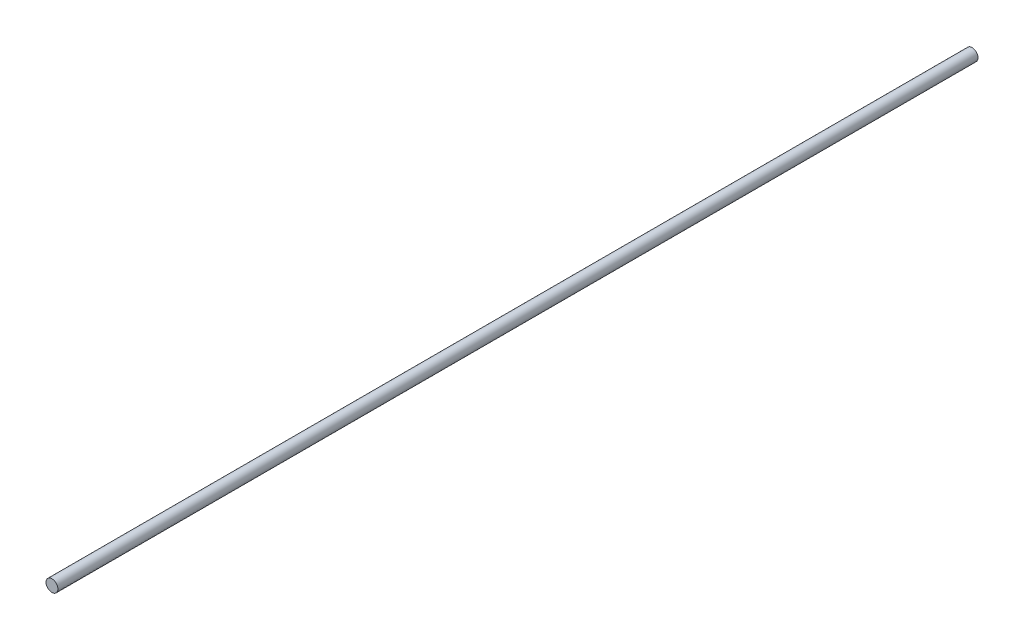
ISO-10303-21;
HEADER;
FILE_DESCRIPTION(('STEP AP214'),'2;1');
FILE_NAME('part.step','',(''),(''),'','','');
FILE_SCHEMA(('AUTOMOTIVE_DESIGN { 1 0 10303 214 1 1 1 1 }'));
ENDSEC;
DATA;
#1=APPLICATION_CONTEXT('core data for automotive mechanical design processes');
#2=APPLICATION_PROTOCOL_DEFINITION('international standard','automotive_design',2000,#1);
#3=PRODUCT_CONTEXT('',#1,'mechanical');
#4=PRODUCT('Part','Part','',(#3));
#5=PRODUCT_RELATED_PRODUCT_CATEGORY('part','',(#4));
#6=PRODUCT_DEFINITION_FORMATION('','',#4);
#7=PRODUCT_DEFINITION_CONTEXT('part definition',#1,'design');
#8=PRODUCT_DEFINITION('design','',#6,#7);
#9=PRODUCT_DEFINITION_SHAPE('','',#8);
#10=(LENGTH_UNIT() NAMED_UNIT(*) SI_UNIT(.MILLI.,.METRE.));
#11=(NAMED_UNIT(*) PLANE_ANGLE_UNIT() SI_UNIT($,.RADIAN.));
#12=(NAMED_UNIT(*) SI_UNIT($,.STERADIAN.) SOLID_ANGLE_UNIT());
#13=UNCERTAINTY_MEASURE_WITH_UNIT(LENGTH_MEASURE(1.E-05),#10,'distance_accuracy_value','');
#14=(GEOMETRIC_REPRESENTATION_CONTEXT(3) GLOBAL_UNCERTAINTY_ASSIGNED_CONTEXT((#13)) GLOBAL_UNIT_ASSIGNED_CONTEXT((#10,
#11,#12)) REPRESENTATION_CONTEXT('',''));
#15=CARTESIAN_POINT('',(0.,0.,0.));
#16=DIRECTION('',(0.,0.,1.));
#17=DIRECTION('',(1.,0.,0.));
#18=AXIS2_PLACEMENT_3D('',#15,#16,#17);
#19=CARTESIAN_POINT('',(0.,0.,245.95));
#20=DIRECTION('',(0.,0.,-1.));
#21=DIRECTION('',(-1.,0.,0.));
#22=AXIS2_PLACEMENT_3D('',#19,#20,#21);
#23=CYLINDRICAL_SURFACE('',#22,1.5875);
#24=CARTESIAN_POINT('',(0.,0.,245.95));
#25=DIRECTION('',(0.,0.,1.));
#26=DIRECTION('',(1.,0.,0.));
#27=AXIS2_PLACEMENT_3D('',#24,#25,#26);
#28=CIRCLE('',#27,1.5875);
#29=CARTESIAN_POINT('',(-1.5875,0.,245.95));
#30=VERTEX_POINT('',#29);
#31=EDGE_CURVE('E10',#30,#30,#28,.T.);
#32=CARTESIAN_POINT('',(0.,0.,0.));
#33=DIRECTION('',(0.,0.,1.));
#34=DIRECTION('',(1.,0.,0.));
#35=AXIS2_PLACEMENT_3D('',#32,#33,#34);
#36=CIRCLE('',#35,1.5875);
#37=CARTESIAN_POINT('',(-1.5875,0.,0.));
#38=VERTEX_POINT('',#37);
#39=EDGE_CURVE('E35',#38,#38,#36,.T.);
#40=CARTESIAN_POINT('',(-1.5875,0.,245.95));
#41=CARTESIAN_POINT('',(-1.5875,0.,243.388020833333));
#42=CARTESIAN_POINT('',(-1.5875,0.,240.826041666667));
#43=CARTESIAN_POINT('',(-1.5875,0.,235.702083333333));
#44=CARTESIAN_POINT('',(-1.5875,0.,233.140104166667));
#45=CARTESIAN_POINT('',(-1.5875,0.,228.016145833333));
#46=CARTESIAN_POINT('',(-1.5875,0.,225.454166666667));
#47=CARTESIAN_POINT('',(-1.5875,0.,220.330208333333));
#48=CARTESIAN_POINT('',(-1.5875,0.,217.768229166667));
#49=CARTESIAN_POINT('',(-1.5875,0.,212.644270833333));
#50=CARTESIAN_POINT('',(-1.5875,0.,210.082291666667));
#51=CARTESIAN_POINT('',(-1.5875,0.,204.958333333333));
#52=CARTESIAN_POINT('',(-1.5875,0.,202.396354166667));
#53=CARTESIAN_POINT('',(-1.5875,0.,197.272395833333));
#54=CARTESIAN_POINT('',(-1.5875,0.,194.710416666667));
#55=CARTESIAN_POINT('',(-1.5875,0.,189.586458333333));
#56=CARTESIAN_POINT('',(-1.5875,0.,187.024479166667));
#57=CARTESIAN_POINT('',(-1.5875,0.,181.900520833333));
#58=CARTESIAN_POINT('',(-1.5875,0.,179.338541666667));
#59=CARTESIAN_POINT('',(-1.5875,0.,174.214583333333));
#60=CARTESIAN_POINT('',(-1.5875,0.,171.652604166667));
#61=CARTESIAN_POINT('',(-1.5875,0.,166.528645833333));
#62=CARTESIAN_POINT('',(-1.5875,0.,163.966666666667));
#63=CARTESIAN_POINT('',(-1.5875,0.,158.842708333333));
#64=CARTESIAN_POINT('',(-1.5875,0.,156.280729166667));
#65=CARTESIAN_POINT('',(-1.5875,0.,151.156770833333));
#66=CARTESIAN_POINT('',(-1.5875,0.,148.594791666667));
#67=CARTESIAN_POINT('',(-1.5875,0.,143.470833333333));
#68=CARTESIAN_POINT('',(-1.5875,0.,140.908854166667));
#69=CARTESIAN_POINT('',(-1.5875,0.,135.784895833333));
#70=CARTESIAN_POINT('',(-1.5875,0.,133.222916666667));
#71=CARTESIAN_POINT('',(-1.5875,0.,128.098958333333));
#72=CARTESIAN_POINT('',(-1.5875,0.,125.536979166667));
#73=CARTESIAN_POINT('',(-1.5875,0.,120.413020833333));
#74=CARTESIAN_POINT('',(-1.5875,0.,117.851041666667));
#75=CARTESIAN_POINT('',(-1.5875,0.,112.727083333333));
#76=CARTESIAN_POINT('',(-1.5875,0.,110.165104166667));
#77=CARTESIAN_POINT('',(-1.5875,0.,105.041145833333));
#78=CARTESIAN_POINT('',(-1.5875,0.,102.479166666667));
#79=CARTESIAN_POINT('',(-1.5875,0.,97.3552083333333));
#80=CARTESIAN_POINT('',(-1.5875,0.,94.7932291666666));
#81=CARTESIAN_POINT('',(-1.5875,0.,89.6692708333333));
#82=CARTESIAN_POINT('',(-1.5875,0.,87.1072916666666));
#83=CARTESIAN_POINT('',(-1.5875,0.,81.9833333333333));
#84=CARTESIAN_POINT('',(-1.5875,0.,79.4213541666666));
#85=CARTESIAN_POINT('',(-1.5875,0.,74.2973958333333));
#86=CARTESIAN_POINT('',(-1.5875,0.,71.7354166666667));
#87=CARTESIAN_POINT('',(-1.5875,0.,66.6114583333333));
#88=CARTESIAN_POINT('',(-1.5875,0.,64.0494791666666));
#89=CARTESIAN_POINT('',(-1.5875,0.,58.9255208333333));
#90=CARTESIAN_POINT('',(-1.5875,0.,56.3635416666666));
#91=CARTESIAN_POINT('',(-1.5875,0.,51.2395833333333));
#92=CARTESIAN_POINT('',(-1.5875,0.,48.6776041666666));
#93=CARTESIAN_POINT('',(-1.5875,0.,43.5536458333333));
#94=CARTESIAN_POINT('',(-1.5875,0.,40.9916666666666));
#95=CARTESIAN_POINT('',(-1.5875,0.,35.8677083333333));
#96=CARTESIAN_POINT('',(-1.5875,0.,33.3057291666667));
#97=CARTESIAN_POINT('',(-1.5875,0.,28.1817708333333));
#98=CARTESIAN_POINT('',(-1.5875,0.,25.6197916666666));
#99=CARTESIAN_POINT('',(-1.5875,0.,20.4958333333333));
#100=CARTESIAN_POINT('',(-1.5875,0.,17.9338541666666));
#101=CARTESIAN_POINT('',(-1.5875,0.,12.8098958333333));
#102=CARTESIAN_POINT('',(-1.5875,0.,10.2479166666666));
#103=CARTESIAN_POINT('',(-1.5875,0.,5.1239583333333));
#104=CARTESIAN_POINT('',(-1.5875,0.,2.56197916666663));
#105=CARTESIAN_POINT('',(-1.5875,0.,0.));
#106=B_SPLINE_CURVE_WITH_KNOTS('',3,(#40,#41,#42,#43,#44,#45,#46,#47,#48,#49,#50,#51,#52,#53,
#54,#55,#56,#57,#58,#59,#60,#61,#62,#63,#64,#65,#66,#67,#68,#69,#70,#71,#72,#73,#74,#75,#76,#77,
#78,#79,#80,#81,#82,#83,#84,#85,#86,#87,#88,#89,#90,#91,#92,#93,#94,#95,#96,#97,#98,#99,#100,
#101,#102,#103,#104,#105),.UNSPECIFIED.,.F.,.F.,(4,2,2,2,2,2,2,2,2,2,2,2,2,2,2,2,2,2,2,2,2,2,2,
2,2,2,2,2,2,2,2,2,4),(0.,7.68593749999999,15.371875,23.0578125,30.74375,38.4296875,46.115625,
53.8015625,61.4875,69.1734375,76.859375,84.5453125,92.23125,99.9171875,107.603125,115.2890625,
122.975,130.6609375,138.346875,146.0328125,153.71875,161.4046875,169.090625,176.7765625,
184.4625,192.1484375,199.834375,207.5203125,215.20625,222.8921875,230.578125,238.2640625,
245.95),.UNSPECIFIED.);
#107=EDGE_CURVE('BSEAM32',#30,#38,#106,.T.);
#108=ORIENTED_EDGE('',*,*,#31,.F.);
#109=ORIENTED_EDGE('',*,*,#39,.T.);
#110=ORIENTED_EDGE('',*,*,#107,.T.);
#111=ORIENTED_EDGE('',*,*,#107,.F.);
#112=EDGE_LOOP('',(#108,#110,#109,#111));
#113=FACE_BOUND('',#112,.T.);
#114=ADVANCED_FACE('F32',(#113),#23,.T.);
#115=CARTESIAN_POINT('',(0.,0.,245.95));
#116=DIRECTION('',(0.,0.,1.));
#117=DIRECTION('',(1.,0.,0.));
#118=AXIS2_PLACEMENT_3D('',#115,#116,#117);
#119=PLANE('',#118);
#120=ORIENTED_EDGE('',*,*,#31,.T.);
#121=EDGE_LOOP('',(#120));
#122=FACE_BOUND('',#121,.T.);
#123=ADVANCED_FACE('F47',(#122),#119,.T.);
#124=CARTESIAN_POINT('',(0.,0.,0.));
#125=DIRECTION('',(0.,0.,1.));
#126=DIRECTION('',(1.,0.,0.));
#127=AXIS2_PLACEMENT_3D('',#124,#125,#126);
#128=PLANE('',#127);
#129=ORIENTED_EDGE('',*,*,#39,.F.);
#130=EDGE_LOOP('',(#129));
#131=FACE_BOUND('',#130,.T.);
#132=ADVANCED_FACE('F45',(#131),#128,.F.);
#133=CLOSED_SHELL('',(#114,#123,#132));
#134=MANIFOLD_SOLID_BREP('B2',#133);
#135=ADVANCED_BREP_SHAPE_REPRESENTATION('',(#18,#134),#14);
#136=SHAPE_DEFINITION_REPRESENTATION(#9,#135);
ENDSEC;
END-ISO-10303-21;
